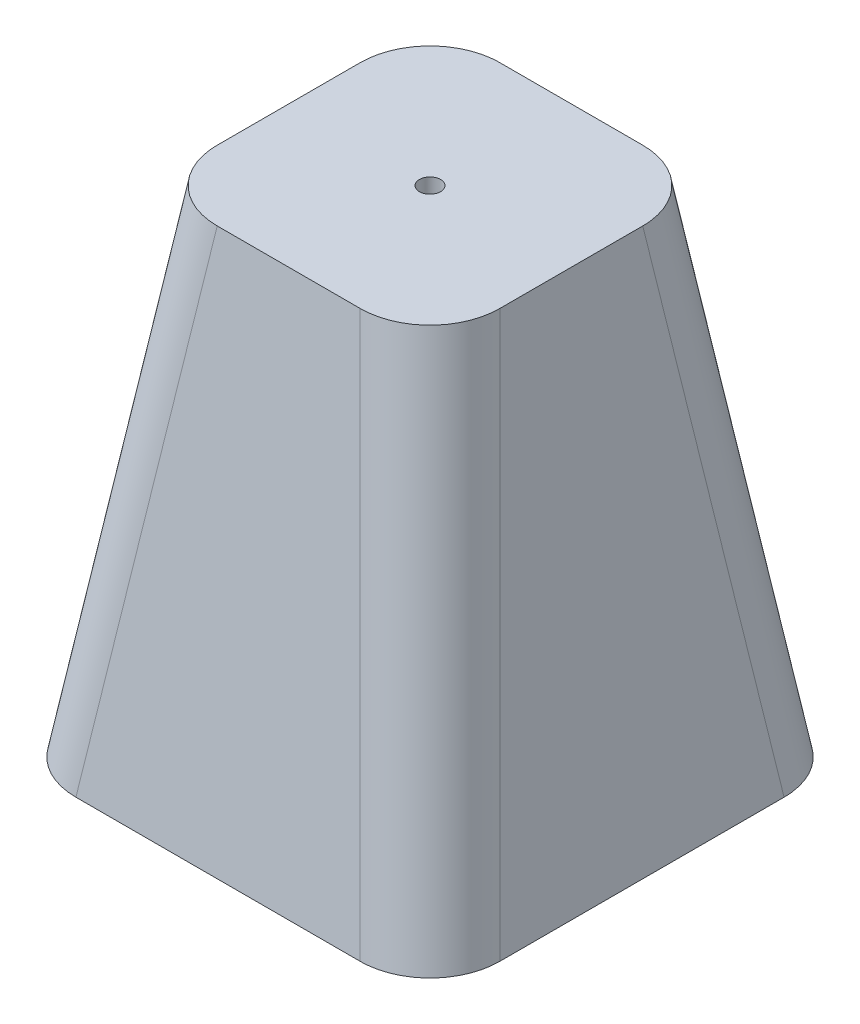
ISO-10303-21;
HEADER;
FILE_DESCRIPTION(('STEP AP214'),'2;1');
FILE_NAME('part.step','',(''),(''),'','','');
FILE_SCHEMA(('AUTOMOTIVE_DESIGN { 1 0 10303 214 1 1 1 1 }'));
ENDSEC;
DATA;
#1=APPLICATION_CONTEXT('core data for automotive mechanical design processes');
#2=APPLICATION_PROTOCOL_DEFINITION('international standard','automotive_design',2000,#1);
#3=PRODUCT_CONTEXT('',#1,'mechanical');
#4=PRODUCT('Part','Part','',(#3));
#5=PRODUCT_RELATED_PRODUCT_CATEGORY('part','',(#4));
#6=PRODUCT_DEFINITION_FORMATION('','',#4);
#7=PRODUCT_DEFINITION_CONTEXT('part definition',#1,'design');
#8=PRODUCT_DEFINITION('design','',#6,#7);
#9=PRODUCT_DEFINITION_SHAPE('','',#8);
#10=(LENGTH_UNIT() NAMED_UNIT(*) SI_UNIT(.MILLI.,.METRE.));
#11=(NAMED_UNIT(*) PLANE_ANGLE_UNIT() SI_UNIT($,.RADIAN.));
#12=(NAMED_UNIT(*) SI_UNIT($,.STERADIAN.) SOLID_ANGLE_UNIT());
#13=UNCERTAINTY_MEASURE_WITH_UNIT(LENGTH_MEASURE(1.E-05),#10,'distance_accuracy_value','');
#14=(GEOMETRIC_REPRESENTATION_CONTEXT(3) GLOBAL_UNCERTAINTY_ASSIGNED_CONTEXT((#13)) GLOBAL_UNIT_ASSIGNED_CONTEXT((#10,
#11,#12)) REPRESENTATION_CONTEXT('',''));
#15=CARTESIAN_POINT('',(0.,0.,0.));
#16=DIRECTION('',(0.,0.,1.));
#17=DIRECTION('',(1.,0.,0.));
#18=AXIS2_PLACEMENT_3D('',#15,#16,#17);
#19=CARTESIAN_POINT('',(0.,0.,0.));
#20=DIRECTION('',(0.,-1.,0.));
#21=DIRECTION('',(0.,0.,-1.));
#22=AXIS2_PLACEMENT_3D('',#19,#20,#21);
#23=PLANE('',#22);
#24=CARTESIAN_POINT('',(0.,0.,0.));
#25=DIRECTION('',(0.,-1.,0.));
#26=DIRECTION('',(0.,0.,-1.));
#27=AXIS2_PLACEMENT_3D('',#24,#25,#26);
#28=CIRCLE('',#27,1.5);
#29=CARTESIAN_POINT('',(0.,0.,-1.5));
#30=VERTEX_POINT('',#29);
#31=EDGE_CURVE('E505',#30,#30,#28,.T.);
#32=ORIENTED_EDGE('',*,*,#31,.F.);
#33=EDGE_LOOP('',(#32));
#34=FACE_BOUND('',#33,.T.);
#35=DIRECTION('',(0.,0.,1.));
#36=VECTOR('',#35,1.);
#37=CARTESIAN_POINT('',(-30.,0.,30.));
#38=LINE('',#37,#36);
#39=CARTESIAN_POINT('',(-30.,0.,-20.1005050633883));
#40=VERTEX_POINT('',#39);
#41=CARTESIAN_POINT('',(-30.,0.,20.1005050633883));
#42=VERTEX_POINT('',#41);
#43=EDGE_CURVE('E284',#40,#42,#38,.T.);
#44=ORIENTED_EDGE('',*,*,#43,.F.);
#45=CARTESIAN_POINT('',(-19.8984745544779,0.,-19.8984745544779));
#46=DIRECTION('',(0.,-1.,0.));
#47=DIRECTION('',(-0.707106781186547,0.,-0.707106781186548));
#48=AXIS2_PLACEMENT_3D('',#45,#46,#47);
#49=ELLIPSE('',#48,10.2020406122041,10.);
#50=CARTESIAN_POINT('',(-20.1005050633883,0.,-30.));
#51=VERTEX_POINT('',#50);
#52=EDGE_CURVE('E249',#40,#51,#49,.T.);
#53=ORIENTED_EDGE('',*,*,#52,.T.);
#54=DIRECTION('',(-1.,0.,0.));
#55=VECTOR('',#54,1.);
#56=CARTESIAN_POINT('',(-30.,0.,-30.));
#57=LINE('',#56,#55);
#58=CARTESIAN_POINT('',(20.1005050633883,0.,-30.));
#59=VERTEX_POINT('',#58);
#60=EDGE_CURVE('E237',#59,#51,#57,.T.);
#61=ORIENTED_EDGE('',*,*,#60,.F.);
#62=CARTESIAN_POINT('',(19.8984745544779,0.,-19.8984745544779));
#63=DIRECTION('',(0.,-1.,0.));
#64=DIRECTION('',(0.707106781186547,0.,-0.707106781186548));
#65=AXIS2_PLACEMENT_3D('',#62,#63,#64);
#66=ELLIPSE('',#65,10.2020406122041,10.);
#67=CARTESIAN_POINT('',(30.,0.,-20.1005050633883));
#68=VERTEX_POINT('',#67);
#69=EDGE_CURVE('E245',#59,#68,#66,.T.);
#70=ORIENTED_EDGE('',*,*,#69,.T.);
#71=DIRECTION('',(0.,0.,-1.));
#72=VECTOR('',#71,1.);
#73=CARTESIAN_POINT('',(30.,0.,30.));
#74=LINE('',#73,#72);
#75=CARTESIAN_POINT('',(30.,0.,20.1005050633883));
#76=VERTEX_POINT('',#75);
#77=EDGE_CURVE('E124',#76,#68,#74,.T.);
#78=ORIENTED_EDGE('',*,*,#77,.F.);
#79=CARTESIAN_POINT('',(19.8984745544779,0.,19.8984745544779));
#80=DIRECTION('',(0.,-1.,0.));
#81=DIRECTION('',(0.707106781186548,0.,0.707106781186547));
#82=AXIS2_PLACEMENT_3D('',#79,#80,#81);
#83=ELLIPSE('',#82,10.2020406122041,10.);
#84=CARTESIAN_POINT('',(20.1005050633883,0.,30.));
#85=VERTEX_POINT('',#84);
#86=EDGE_CURVE('E240',#76,#85,#83,.T.);
#87=ORIENTED_EDGE('',*,*,#86,.T.);
#88=DIRECTION('',(1.,0.,0.));
#89=VECTOR('',#88,1.);
#90=CARTESIAN_POINT('',(-30.,0.,30.));
#91=LINE('',#90,#89);
#92=CARTESIAN_POINT('',(10.5401740423666,0.,30.));
#93=VERTEX_POINT('',#92);
#94=EDGE_CURVE('E281',#93,#85,#91,.T.);
#95=ORIENTED_EDGE('',*,*,#94,.F.);
#96=CARTESIAN_POINT('',(-20.1005050633883,0.,30.));
#97=VERTEX_POINT('',#96);
#98=EDGE_CURVE('E184',#97,#93,#91,.T.);
#99=ORIENTED_EDGE('',*,*,#98,.F.);
#100=CARTESIAN_POINT('',(-19.8984745544779,0.,19.8984745544779));
#101=DIRECTION('',(0.,-1.,0.));
#102=DIRECTION('',(-0.707106781186548,0.,0.707106781186548));
#103=AXIS2_PLACEMENT_3D('',#100,#101,#102);
#104=ELLIPSE('',#103,10.2020406122041,10.);
#105=EDGE_CURVE('E238',#97,#42,#104,.T.);
#106=ORIENTED_EDGE('',*,*,#105,.T.);
#107=EDGE_LOOP('',(#44,#53,#61,#70,#78,#87,#95,#99,#106));
#108=FACE_BOUND('',#107,.T.);
#109=ADVANCED_FACE('F43',(#34,#108),#23,.T.);
#110=CARTESIAN_POINT('',(0.,70.,0.));
#111=DIRECTION('',(0.,-1.,0.));
#112=DIRECTION('',(0.,0.,-1.));
#113=AXIS2_PLACEMENT_3D('',#110,#111,#112);
#114=PLANE('',#113);
#115=CARTESIAN_POINT('',(0.,70.,0.));
#116=DIRECTION('',(0.,-1.,0.));
#117=DIRECTION('',(0.,0.,-1.));
#118=AXIS2_PLACEMENT_3D('',#115,#116,#117);
#119=CIRCLE('',#118,1.5);
#120=CARTESIAN_POINT('',(0.,70.,-1.5));
#121=VERTEX_POINT('',#120);
#122=EDGE_CURVE('E510',#121,#121,#119,.T.);
#123=ORIENTED_EDGE('',*,*,#122,.T.);
#124=EDGE_LOOP('',(#123));
#125=FACE_BOUND('',#124,.T.);
#126=DIRECTION('',(-1.,0.,0.));
#127=VECTOR('',#126,1.);
#128=CARTESIAN_POINT('',(-20.,70.,-20.));
#129=LINE('',#128,#127);
#130=CARTESIAN_POINT('',(10.1005050633883,70.,-20.));
#131=VERTEX_POINT('',#130);
#132=CARTESIAN_POINT('',(-10.1005050633883,70.,-20.));
#133=VERTEX_POINT('',#132);
#134=EDGE_CURVE('E258',#131,#133,#129,.T.);
#135=ORIENTED_EDGE('',*,*,#134,.T.);
#136=CARTESIAN_POINT('',(-9.8984745544779,70.,-9.89847455447788));
#137=DIRECTION('',(0.,-1.,0.));
#138=DIRECTION('',(-0.707106781186547,0.,-0.707106781186548));
#139=AXIS2_PLACEMENT_3D('',#136,#137,#138);
#140=ELLIPSE('',#139,10.2020406122041,10.);
#141=CARTESIAN_POINT('',(-20.,70.,-10.1005050633883));
#142=VERTEX_POINT('',#141);
#143=EDGE_CURVE('E299',#133,#142,#140,.F.);
#144=ORIENTED_EDGE('',*,*,#143,.T.);
#145=DIRECTION('',(0.,0.,1.));
#146=VECTOR('',#145,1.);
#147=CARTESIAN_POINT('',(-20.,70.,20.));
#148=LINE('',#147,#146);
#149=CARTESIAN_POINT('',(-20.,70.,10.1005050633883));
#150=VERTEX_POINT('',#149);
#151=EDGE_CURVE('E129',#142,#150,#148,.T.);
#152=ORIENTED_EDGE('',*,*,#151,.T.);
#153=CARTESIAN_POINT('',(-9.8984745544779,70.,9.8984745544779));
#154=DIRECTION('',(0.,-1.,0.));
#155=DIRECTION('',(-0.707106781186548,0.,0.707106781186548));
#156=AXIS2_PLACEMENT_3D('',#153,#154,#155);
#157=ELLIPSE('',#156,10.2020406122041,10.);
#158=CARTESIAN_POINT('',(-10.1005050633883,70.,20.));
#159=VERTEX_POINT('',#158);
#160=EDGE_CURVE('E67',#150,#159,#157,.F.);
#161=ORIENTED_EDGE('',*,*,#160,.T.);
#162=DIRECTION('',(1.,0.,0.));
#163=VECTOR('',#162,1.);
#164=CARTESIAN_POINT('',(-20.,70.,20.));
#165=LINE('',#164,#163);
#166=CARTESIAN_POINT('',(7.352,70.,20.));
#167=VERTEX_POINT('',#166);
#168=EDGE_CURVE('E47',#159,#167,#165,.T.);
#169=ORIENTED_EDGE('',*,*,#168,.T.);
#170=CARTESIAN_POINT('',(10.1005050633883,70.,20.));
#171=VERTEX_POINT('',#170);
#172=EDGE_CURVE('E118',#167,#171,#165,.T.);
#173=ORIENTED_EDGE('',*,*,#172,.T.);
#174=CARTESIAN_POINT('',(9.89847455447789,70.,9.8984745544779));
#175=DIRECTION('',(0.,-1.,0.));
#176=DIRECTION('',(0.707106781186548,0.,0.707106781186547));
#177=AXIS2_PLACEMENT_3D('',#174,#175,#176);
#178=ELLIPSE('',#177,10.2020406122041,10.);
#179=CARTESIAN_POINT('',(20.,70.,10.1005050633883));
#180=VERTEX_POINT('',#179);
#181=EDGE_CURVE('E306',#171,#180,#178,.F.);
#182=ORIENTED_EDGE('',*,*,#181,.T.);
#183=DIRECTION('',(0.,0.,-1.));
#184=VECTOR('',#183,1.);
#185=CARTESIAN_POINT('',(20.,70.,20.));
#186=LINE('',#185,#184);
#187=CARTESIAN_POINT('',(20.,70.,-10.1005050633883));
#188=VERTEX_POINT('',#187);
#189=EDGE_CURVE('E277',#180,#188,#186,.T.);
#190=ORIENTED_EDGE('',*,*,#189,.T.);
#191=CARTESIAN_POINT('',(9.89847455447789,70.,-9.89847455447789));
#192=DIRECTION('',(0.,-1.,0.));
#193=DIRECTION('',(0.707106781186547,0.,-0.707106781186548));
#194=AXIS2_PLACEMENT_3D('',#191,#192,#193);
#195=ELLIPSE('',#194,10.2020406122041,10.);
#196=EDGE_CURVE('E309',#188,#131,#195,.F.);
#197=ORIENTED_EDGE('',*,*,#196,.T.);
#198=EDGE_LOOP('',(#135,#144,#152,#161,#169,#173,#182,#190,#197));
#199=FACE_BOUND('',#198,.T.);
#200=ADVANCED_FACE('F117',(#125,#199),#114,.F.);
#201=CARTESIAN_POINT('',(7.352,70.,20.));
#202=DIRECTION('',(0.,0.141421356237309,0.989949493661166));
#203=DIRECTION('',(-1.,0.,0.));
#204=AXIS2_PLACEMENT_3D('',#201,#202,#203);
#205=PLANE('',#204);
#206=ORIENTED_EDGE('',*,*,#94,.T.);
#207=DIRECTION('',(0.140028008402801,-0.980196058819607,0.140028008402801));
#208=VECTOR('',#207,1.);
#209=CARTESIAN_POINT('',(10.0466128072435,70.3772457930141,19.9461077438551));
#210=LINE('',#209,#208);
#211=EDGE_CURVE('E12',#85,#171,#210,.F.);
#212=ORIENTED_EDGE('',*,*,#211,.T.);
#213=ORIENTED_EDGE('',*,*,#172,.F.);
#214=ORIENTED_EDGE('',*,*,#168,.F.);
#215=DIRECTION('',(-0.140028008402801,-0.980196058819607,0.140028008402801));
#216=VECTOR('',#215,1.);
#217=CARTESIAN_POINT('',(-9.75829908175328,72.3954418714455,19.6577940183649));
#218=LINE('',#217,#216);
#219=EDGE_CURVE('E53',#159,#97,#218,.T.);
#220=ORIENTED_EDGE('',*,*,#219,.T.);
#221=ORIENTED_EDGE('',*,*,#98,.T.);
#222=EDGE_LOOP('',(#206,#212,#213,#214,#220,#221));
#223=FACE_BOUND('',#222,.T.);
#224=ADVANCED_FACE('F128',(#223),#205,.T.);
#225=CARTESIAN_POINT('',(-20.,70.,20.));
#226=DIRECTION('',(-0.989949493661166,0.141421356237309,0.));
#227=DIRECTION('',(0.,0.,-1.));
#228=AXIS2_PLACEMENT_3D('',#225,#226,#227);
#229=PLANE('',#228);
#230=ORIENTED_EDGE('',*,*,#151,.F.);
#231=DIRECTION('',(-0.140028008402801,-0.980196058819607,-0.140028008402801));
#232=VECTOR('',#231,1.);
#233=CARTESIAN_POINT('',(-19.4097940183649,74.1314418714455,-9.51029908175327));
#234=LINE('',#233,#232);
#235=EDGE_CURVE('E241',#142,#40,#234,.T.);
#236=ORIENTED_EDGE('',*,*,#235,.T.);
#237=ORIENTED_EDGE('',*,*,#43,.T.);
#238=DIRECTION('',(-0.140028008402801,-0.980196058819607,0.140028008402801));
#239=VECTOR('',#238,1.);
#240=CARTESIAN_POINT('',(-20.1941077438551,68.6412457930141,10.2946128072435));
#241=LINE('',#240,#239);
#242=EDGE_CURVE('E295',#42,#150,#241,.F.);
#243=ORIENTED_EDGE('',*,*,#242,.T.);
#244=EDGE_LOOP('',(#230,#236,#237,#243));
#245=FACE_BOUND('',#244,.T.);
#246=ADVANCED_FACE('F151',(#245),#229,.T.);
#247=CARTESIAN_POINT('',(-20.,70.,-20.));
#248=DIRECTION('',(0.,0.14142135623731,-0.989949493661166));
#249=DIRECTION('',(1.,0.,0.));
#250=AXIS2_PLACEMENT_3D('',#247,#248,#249);
#251=PLANE('',#250);
#252=ORIENTED_EDGE('',*,*,#60,.T.);
#253=DIRECTION('',(-0.140028008402801,-0.980196058819607,-0.140028008402801));
#254=VECTOR('',#253,1.);
#255=CARTESIAN_POINT('',(-10.2946128072435,68.6412457930141,-20.1941077438551));
#256=LINE('',#255,#254);
#257=EDGE_CURVE('E307',#51,#133,#256,.F.);
#258=ORIENTED_EDGE('',*,*,#257,.T.);
#259=ORIENTED_EDGE('',*,*,#134,.F.);
#260=DIRECTION('',(0.140028008402801,-0.980196058819607,-0.140028008402801));
#261=VECTOR('',#260,1.);
#262=CARTESIAN_POINT('',(9.51029908175327,74.1314418714455,-19.4097940183649));
#263=LINE('',#262,#261);
#264=EDGE_CURVE('E253',#131,#59,#263,.T.);
#265=ORIENTED_EDGE('',*,*,#264,.T.);
#266=EDGE_LOOP('',(#252,#258,#259,#265));
#267=FACE_BOUND('',#266,.T.);
#268=ADVANCED_FACE('F352',(#267),#251,.T.);
#269=CARTESIAN_POINT('',(20.,70.,-20.));
#270=DIRECTION('',(0.989949493661166,0.14142135623731,0.));
#271=DIRECTION('',(0.,0.,1.));
#272=AXIS2_PLACEMENT_3D('',#269,#270,#271);
#273=PLANE('',#272);
#274=ORIENTED_EDGE('',*,*,#77,.T.);
#275=DIRECTION('',(0.140028008402801,-0.980196058819607,-0.140028008402801));
#276=VECTOR('',#275,1.);
#277=CARTESIAN_POINT('',(20.1941077438551,68.6412457930141,-10.2946128072435));
#278=LINE('',#277,#276);
#279=EDGE_CURVE('E326',#68,#188,#278,.F.);
#280=ORIENTED_EDGE('',*,*,#279,.T.);
#281=ORIENTED_EDGE('',*,*,#189,.F.);
#282=DIRECTION('',(0.140028008402801,-0.980196058819607,0.140028008402801));
#283=VECTOR('',#282,1.);
#284=CARTESIAN_POINT('',(19.4097940183649,74.1314418714455,9.51029908175328));
#285=LINE('',#284,#283);
#286=EDGE_CURVE('E321',#180,#76,#285,.T.);
#287=ORIENTED_EDGE('',*,*,#286,.T.);
#288=EDGE_LOOP('',(#274,#280,#281,#287));
#289=FACE_BOUND('',#288,.T.);
#290=ADVANCED_FACE('F211',(#289),#273,.T.);
#291=CARTESIAN_POINT('',(0.,3.,0.));
#292=DIRECTION('',(0.,-1.,0.));
#293=DIRECTION('',(0.,0.,-1.));
#294=AXIS2_PLACEMENT_3D('',#291,#292,#293);
#295=CYLINDRICAL_SURFACE('',#294,1.5);
#296=CARTESIAN_POINT('',(0.,3.,0.));
#297=DIRECTION('',(0.,-1.,0.));
#298=DIRECTION('',(0.,0.,-1.));
#299=AXIS2_PLACEMENT_3D('',#296,#297,#298);
#300=CIRCLE('',#299,1.5);
#301=CARTESIAN_POINT('',(0.,3.,-1.5));
#302=VERTEX_POINT('',#301);
#303=EDGE_CURVE('E343',#302,#302,#300,.T.);
#304=ORIENTED_EDGE('',*,*,#303,.F.);
#305=EDGE_LOOP('',(#304));
#306=FACE_BOUND('',#305,.T.);
#307=ORIENTED_EDGE('',*,*,#31,.T.);
#308=EDGE_LOOP('',(#307));
#309=FACE_BOUND('',#308,.T.);
#310=ADVANCED_FACE('F392',(#306,#309),#295,.F.);
#311=CARTESIAN_POINT('',(0.,3.,0.));
#312=DIRECTION('',(0.,-1.,0.));
#313=DIRECTION('',(0.,0.,-1.));
#314=AXIS2_PLACEMENT_3D('',#311,#312,#313);
#315=PLANE('',#314);
#316=ORIENTED_EDGE('',*,*,#303,.T.);
#317=EDGE_LOOP('',(#316));
#318=FACE_BOUND('',#317,.T.);
#319=ADVANCED_FACE('F431',(#318),#315,.T.);
#320=CARTESIAN_POINT('',(0.,67.,0.));
#321=DIRECTION('',(0.,1.,0.));
#322=DIRECTION('',(0.,0.,1.));
#323=AXIS2_PLACEMENT_3D('',#320,#321,#322);
#324=CYLINDRICAL_SURFACE('',#323,1.5);
#325=CARTESIAN_POINT('',(0.,67.,0.));
#326=DIRECTION('',(0.,-1.,0.));
#327=DIRECTION('',(0.,0.,-1.));
#328=AXIS2_PLACEMENT_3D('',#325,#326,#327);
#329=CIRCLE('',#328,1.5);
#330=CARTESIAN_POINT('',(0.,67.,-1.5));
#331=VERTEX_POINT('',#330);
#332=EDGE_CURVE('E506',#331,#331,#329,.T.);
#333=ORIENTED_EDGE('',*,*,#332,.T.);
#334=EDGE_LOOP('',(#333));
#335=FACE_BOUND('',#334,.T.);
#336=ORIENTED_EDGE('',*,*,#122,.F.);
#337=EDGE_LOOP('',(#336));
#338=FACE_BOUND('',#337,.T.);
#339=ADVANCED_FACE('F419',(#335,#338),#324,.F.);
#340=CARTESIAN_POINT('',(0.,67.,0.));
#341=DIRECTION('',(0.,1.,0.));
#342=DIRECTION('',(0.,0.,-1.));
#343=AXIS2_PLACEMENT_3D('',#340,#341,#342);
#344=PLANE('',#343);
#345=ORIENTED_EDGE('',*,*,#332,.F.);
#346=EDGE_LOOP('',(#345));
#347=FACE_BOUND('',#346,.T.);
#348=ADVANCED_FACE('F414',(#347),#344,.T.);
#349=CARTESIAN_POINT('',(-9.51029908175328,72.7172283090724,-9.51029908175326));
#350=DIRECTION('',(-0.140028008402801,-0.980196058819607,-0.140028008402801));
#351=DIRECTION('',(0.,0.14142135623731,-0.989949493661166));
#352=AXIS2_PLACEMENT_3D('',#349,#350,#351);
#353=CYLINDRICAL_SURFACE('',#352,10.);
#354=ORIENTED_EDGE('',*,*,#143,.F.);
#355=ORIENTED_EDGE('',*,*,#257,.F.);
#356=ORIENTED_EDGE('',*,*,#52,.F.);
#357=ORIENTED_EDGE('',*,*,#235,.F.);
#358=EDGE_LOOP('',(#354,#355,#356,#357));
#359=FACE_BOUND('',#358,.T.);
#360=ADVANCED_FACE('F213',(#359),#353,.T.);
#361=CARTESIAN_POINT('',(9.51029908175326,72.7172283090724,-9.51029908175326));
#362=DIRECTION('',(0.140028008402801,-0.980196058819607,-0.140028008402801));
#363=DIRECTION('',(0.,0.14142135623731,-0.989949493661166));
#364=AXIS2_PLACEMENT_3D('',#361,#362,#363);
#365=CYLINDRICAL_SURFACE('',#364,10.);
#366=ORIENTED_EDGE('',*,*,#196,.F.);
#367=ORIENTED_EDGE('',*,*,#279,.F.);
#368=ORIENTED_EDGE('',*,*,#69,.F.);
#369=ORIENTED_EDGE('',*,*,#264,.F.);
#370=EDGE_LOOP('',(#366,#367,#368,#369));
#371=FACE_BOUND('',#370,.T.);
#372=ADVANCED_FACE('F346',(#371),#365,.T.);
#373=CARTESIAN_POINT('',(9.51029908175326,72.7172283090724,9.51029908175328));
#374=DIRECTION('',(0.140028008402801,-0.980196058819607,0.140028008402801));
#375=DIRECTION('',(0.989949493661166,0.14142135623731,0.));
#376=AXIS2_PLACEMENT_3D('',#373,#374,#375);
#377=CYLINDRICAL_SURFACE('',#376,10.);
#378=ORIENTED_EDGE('',*,*,#181,.F.);
#379=ORIENTED_EDGE('',*,*,#211,.F.);
#380=ORIENTED_EDGE('',*,*,#86,.F.);
#381=ORIENTED_EDGE('',*,*,#286,.F.);
#382=EDGE_LOOP('',(#378,#379,#380,#381));
#383=FACE_BOUND('',#382,.T.);
#384=ADVANCED_FACE('F471',(#383),#377,.T.);
#385=CARTESIAN_POINT('',(-9.75829908175328,70.9812283090724,9.75829908175328));
#386=DIRECTION('',(-0.140028008402801,-0.980196058819607,0.140028008402801));
#387=DIRECTION('',(0.,-0.141421356237309,-0.989949493661166));
#388=AXIS2_PLACEMENT_3D('',#385,#386,#387);
#389=CYLINDRICAL_SURFACE('',#388,10.);
#390=ORIENTED_EDGE('',*,*,#160,.F.);
#391=ORIENTED_EDGE('',*,*,#242,.F.);
#392=ORIENTED_EDGE('',*,*,#105,.F.);
#393=ORIENTED_EDGE('',*,*,#219,.F.);
#394=EDGE_LOOP('',(#390,#391,#392,#393));
#395=FACE_BOUND('',#394,.T.);
#396=ADVANCED_FACE('F45',(#395),#389,.T.);
#397=CLOSED_SHELL('',(#109,#200,#224,#246,#268,#290,#310,#319,#339,#348,#360,#372,#384,#396));
#398=MANIFOLD_SOLID_BREP('B2',#397);
#399=ADVANCED_BREP_SHAPE_REPRESENTATION('',(#18,#398),#14);
#400=SHAPE_DEFINITION_REPRESENTATION(#9,#399);
ENDSEC;
END-ISO-10303-21;
